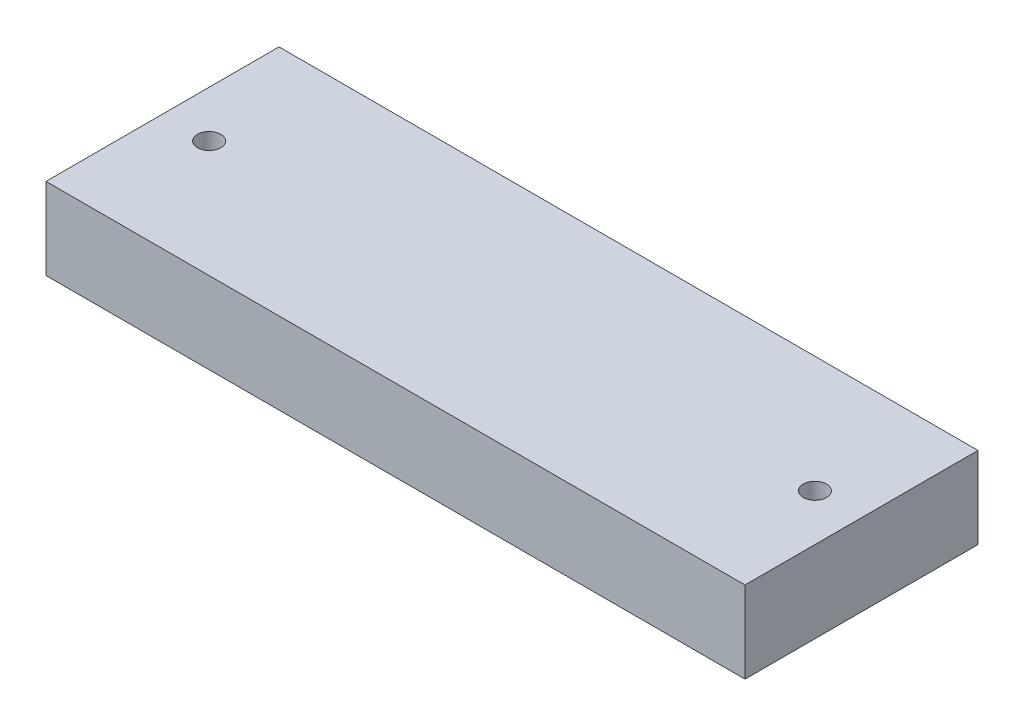
ISO-10303-21;
HEADER;
FILE_DESCRIPTION(('STEP AP214'),'2;1');
FILE_NAME('part.step','',(''),(''),'','','');
FILE_SCHEMA(('AUTOMOTIVE_DESIGN { 1 0 10303 214 1 1 1 1 }'));
ENDSEC;
DATA;
#1=APPLICATION_CONTEXT('core data for automotive mechanical design processes');
#2=APPLICATION_PROTOCOL_DEFINITION('international standard','automotive_design',2000,#1);
#3=PRODUCT_CONTEXT('',#1,'mechanical');
#4=PRODUCT('Part','Part','',(#3));
#5=PRODUCT_RELATED_PRODUCT_CATEGORY('part','',(#4));
#6=PRODUCT_DEFINITION_FORMATION('','',#4);
#7=PRODUCT_DEFINITION_CONTEXT('part definition',#1,'design');
#8=PRODUCT_DEFINITION('design','',#6,#7);
#9=PRODUCT_DEFINITION_SHAPE('','',#8);
#10=(LENGTH_UNIT() NAMED_UNIT(*) SI_UNIT(.MILLI.,.METRE.));
#11=(NAMED_UNIT(*) PLANE_ANGLE_UNIT() SI_UNIT($,.RADIAN.));
#12=(NAMED_UNIT(*) SI_UNIT($,.STERADIAN.) SOLID_ANGLE_UNIT());
#13=UNCERTAINTY_MEASURE_WITH_UNIT(LENGTH_MEASURE(1.E-05),#10,'distance_accuracy_value','');
#14=(GEOMETRIC_REPRESENTATION_CONTEXT(3) GLOBAL_UNCERTAINTY_ASSIGNED_CONTEXT((#13)) GLOBAL_UNIT_ASSIGNED_CONTEXT((#10,
#11,#12)) REPRESENTATION_CONTEXT('',''));
#15=CARTESIAN_POINT('',(0.,0.,0.));
#16=DIRECTION('',(0.,0.,1.));
#17=DIRECTION('',(1.,0.,0.));
#18=AXIS2_PLACEMENT_3D('',#15,#16,#17);
#19=CARTESIAN_POINT('',(150.,35.,-50.));
#20=DIRECTION('',(-1.,0.,0.));
#21=DIRECTION('',(0.,0.,1.));
#22=AXIS2_PLACEMENT_3D('',#19,#20,#21);
#23=PLANE('',#22);
#24=DIRECTION('',(0.,0.,-1.));
#25=VECTOR('',#24,1.);
#26=CARTESIAN_POINT('',(150.,0.,-50.));
#27=LINE('',#26,#25);
#28=CARTESIAN_POINT('',(150.,0.,50.));
#29=VERTEX_POINT('',#28);
#30=CARTESIAN_POINT('',(150.,0.,-50.));
#31=VERTEX_POINT('',#30);
#32=EDGE_CURVE('E107',#29,#31,#27,.T.);
#33=ORIENTED_EDGE('',*,*,#32,.T.);
#34=DIRECTION('',(0.,-1.,0.));
#35=VECTOR('',#34,1.);
#36=CARTESIAN_POINT('',(150.,35.,-50.));
#37=LINE('',#36,#35);
#38=CARTESIAN_POINT('',(150.,35.,-50.));
#39=VERTEX_POINT('',#38);
#40=EDGE_CURVE('E11',#39,#31,#37,.T.);
#41=ORIENTED_EDGE('',*,*,#40,.F.);
#42=DIRECTION('',(0.,0.,-1.));
#43=VECTOR('',#42,1.);
#44=CARTESIAN_POINT('',(150.,35.,-50.));
#45=LINE('',#44,#43);
#46=CARTESIAN_POINT('',(150.,35.,50.));
#47=VERTEX_POINT('',#46);
#48=EDGE_CURVE('E91',#47,#39,#45,.T.);
#49=ORIENTED_EDGE('',*,*,#48,.F.);
#50=DIRECTION('',(0.,-1.,0.));
#51=VECTOR('',#50,1.);
#52=CARTESIAN_POINT('',(150.,35.,50.));
#53=LINE('',#52,#51);
#54=EDGE_CURVE('E103',#47,#29,#53,.T.);
#55=ORIENTED_EDGE('',*,*,#54,.T.);
#56=EDGE_LOOP('',(#33,#41,#49,#55));
#57=FACE_BOUND('',#56,.T.);
#58=ADVANCED_FACE('F39',(#57),#23,.F.);
#59=CARTESIAN_POINT('',(-150.,35.,-50.));
#60=DIRECTION('',(0.,0.,1.));
#61=DIRECTION('',(1.,0.,0.));
#62=AXIS2_PLACEMENT_3D('',#59,#60,#61);
#63=PLANE('',#62);
#64=DIRECTION('',(-1.,0.,0.));
#65=VECTOR('',#64,1.);
#66=CARTESIAN_POINT('',(-150.,0.,-50.));
#67=LINE('',#66,#65);
#68=CARTESIAN_POINT('',(-150.,0.,-50.));
#69=VERTEX_POINT('',#68);
#70=EDGE_CURVE('E96',#31,#69,#67,.T.);
#71=ORIENTED_EDGE('',*,*,#70,.T.);
#72=DIRECTION('',(0.,-1.,0.));
#73=VECTOR('',#72,1.);
#74=CARTESIAN_POINT('',(-150.,35.,-50.));
#75=LINE('',#74,#73);
#76=CARTESIAN_POINT('',(-150.,35.,-50.));
#77=VERTEX_POINT('',#76);
#78=EDGE_CURVE('E48',#77,#69,#75,.T.);
#79=ORIENTED_EDGE('',*,*,#78,.F.);
#80=DIRECTION('',(-1.,0.,0.));
#81=VECTOR('',#80,1.);
#82=CARTESIAN_POINT('',(-150.,35.,-50.));
#83=LINE('',#82,#81);
#84=EDGE_CURVE('E86',#39,#77,#83,.T.);
#85=ORIENTED_EDGE('',*,*,#84,.F.);
#86=ORIENTED_EDGE('',*,*,#40,.T.);
#87=EDGE_LOOP('',(#71,#79,#85,#86));
#88=FACE_BOUND('',#87,.T.);
#89=ADVANCED_FACE('F95',(#88),#63,.F.);
#90=CARTESIAN_POINT('',(-150.,35.,-50.));
#91=DIRECTION('',(1.,0.,0.));
#92=DIRECTION('',(0.,0.,-1.));
#93=AXIS2_PLACEMENT_3D('',#90,#91,#92);
#94=PLANE('',#93);
#95=DIRECTION('',(0.,0.,1.));
#96=VECTOR('',#95,1.);
#97=CARTESIAN_POINT('',(-150.,0.,-50.));
#98=LINE('',#97,#96);
#99=CARTESIAN_POINT('',(-150.,0.,50.));
#100=VERTEX_POINT('',#99);
#101=EDGE_CURVE('E73',#69,#100,#98,.T.);
#102=ORIENTED_EDGE('',*,*,#101,.T.);
#103=DIRECTION('',(0.,-1.,0.));
#104=VECTOR('',#103,1.);
#105=CARTESIAN_POINT('',(-150.,35.,50.));
#106=LINE('',#105,#104);
#107=CARTESIAN_POINT('',(-150.,35.,50.));
#108=VERTEX_POINT('',#107);
#109=EDGE_CURVE('E98',#108,#100,#106,.T.);
#110=ORIENTED_EDGE('',*,*,#109,.F.);
#111=DIRECTION('',(0.,0.,1.));
#112=VECTOR('',#111,1.);
#113=CARTESIAN_POINT('',(-150.,35.,-50.));
#114=LINE('',#113,#112);
#115=EDGE_CURVE('E89',#77,#108,#114,.T.);
#116=ORIENTED_EDGE('',*,*,#115,.F.);
#117=ORIENTED_EDGE('',*,*,#78,.T.);
#118=EDGE_LOOP('',(#102,#110,#116,#117));
#119=FACE_BOUND('',#118,.T.);
#120=ADVANCED_FACE('F99',(#119),#94,.F.);
#121=CARTESIAN_POINT('',(-150.,35.,50.));
#122=DIRECTION('',(0.,0.,-1.));
#123=DIRECTION('',(-1.,0.,0.));
#124=AXIS2_PLACEMENT_3D('',#121,#122,#123);
#125=PLANE('',#124);
#126=DIRECTION('',(1.,0.,0.));
#127=VECTOR('',#126,1.);
#128=CARTESIAN_POINT('',(-150.,0.,50.));
#129=LINE('',#128,#127);
#130=EDGE_CURVE('E79',#100,#29,#129,.T.);
#131=ORIENTED_EDGE('',*,*,#130,.T.);
#132=ORIENTED_EDGE('',*,*,#54,.F.);
#133=DIRECTION('',(1.,0.,0.));
#134=VECTOR('',#133,1.);
#135=CARTESIAN_POINT('',(-150.,35.,50.));
#136=LINE('',#135,#134);
#137=EDGE_CURVE('E56',#108,#47,#136,.T.);
#138=ORIENTED_EDGE('',*,*,#137,.F.);
#139=ORIENTED_EDGE('',*,*,#109,.T.);
#140=EDGE_LOOP('',(#131,#132,#138,#139));
#141=FACE_BOUND('',#140,.T.);
#142=ADVANCED_FACE('F121',(#141),#125,.F.);
#143=CARTESIAN_POINT('',(0.,35.,0.));
#144=DIRECTION('',(0.,1.,0.));
#145=DIRECTION('',(0.,0.,1.));
#146=AXIS2_PLACEMENT_3D('',#143,#144,#145);
#147=PLANE('',#146);
#148=CARTESIAN_POINT('',(-130.,35.,0.));
#149=DIRECTION('',(0.,1.,0.));
#150=DIRECTION('',(0.,0.,1.));
#151=AXIS2_PLACEMENT_3D('',#148,#149,#150);
#152=CIRCLE('',#151,5.00000000000002);
#153=CARTESIAN_POINT('',(-130.,35.,5.00000000000002));
#154=VERTEX_POINT('',#153);
#155=EDGE_CURVE('E136',#154,#154,#152,.T.);
#156=ORIENTED_EDGE('',*,*,#155,.F.);
#157=EDGE_LOOP('',(#156));
#158=FACE_BOUND('',#157,.T.);
#159=CARTESIAN_POINT('',(130.,35.,-1.66533453693773E-13));
#160=DIRECTION('',(0.,1.,0.));
#161=DIRECTION('',(0.,0.,-1.));
#162=AXIS2_PLACEMENT_3D('',#159,#160,#161);
#163=CIRCLE('',#162,5.00000000000002);
#164=CARTESIAN_POINT('',(130.,35.,-5.00000000000018));
#165=VERTEX_POINT('',#164);
#166=EDGE_CURVE('E128',#165,#165,#163,.T.);
#167=ORIENTED_EDGE('',*,*,#166,.F.);
#168=EDGE_LOOP('',(#167));
#169=FACE_BOUND('',#168,.T.);
#170=ORIENTED_EDGE('',*,*,#48,.T.);
#171=ORIENTED_EDGE('',*,*,#84,.T.);
#172=ORIENTED_EDGE('',*,*,#115,.T.);
#173=ORIENTED_EDGE('',*,*,#137,.T.);
#174=EDGE_LOOP('',(#170,#171,#172,#173));
#175=FACE_BOUND('',#174,.T.);
#176=ADVANCED_FACE('F87',(#158,#169,#175),#147,.T.);
#177=CARTESIAN_POINT('',(0.,0.,0.));
#178=DIRECTION('',(0.,1.,0.));
#179=DIRECTION('',(0.,0.,1.));
#180=AXIS2_PLACEMENT_3D('',#177,#178,#179);
#181=PLANE('',#180);
#182=CARTESIAN_POINT('',(-130.,0.,0.));
#183=DIRECTION('',(0.,1.,0.));
#184=DIRECTION('',(0.,0.,1.));
#185=AXIS2_PLACEMENT_3D('',#182,#183,#184);
#186=CIRCLE('',#185,5.00000000000002);
#187=CARTESIAN_POINT('',(-130.,0.,5.00000000000002));
#188=VERTEX_POINT('',#187);
#189=EDGE_CURVE('E111',#188,#188,#186,.T.);
#190=ORIENTED_EDGE('',*,*,#189,.T.);
#191=EDGE_LOOP('',(#190));
#192=FACE_BOUND('',#191,.T.);
#193=CARTESIAN_POINT('',(130.,0.,-1.66533453693773E-13));
#194=DIRECTION('',(0.,1.,0.));
#195=DIRECTION('',(0.,0.,-1.));
#196=AXIS2_PLACEMENT_3D('',#193,#194,#195);
#197=CIRCLE('',#196,5.00000000000002);
#198=CARTESIAN_POINT('',(130.,0.,-5.00000000000018));
#199=VERTEX_POINT('',#198);
#200=EDGE_CURVE('E132',#199,#199,#197,.T.);
#201=ORIENTED_EDGE('',*,*,#200,.T.);
#202=EDGE_LOOP('',(#201));
#203=FACE_BOUND('',#202,.T.);
#204=ORIENTED_EDGE('',*,*,#32,.F.);
#205=ORIENTED_EDGE('',*,*,#130,.F.);
#206=ORIENTED_EDGE('',*,*,#101,.F.);
#207=ORIENTED_EDGE('',*,*,#70,.F.);
#208=EDGE_LOOP('',(#204,#205,#206,#207));
#209=FACE_BOUND('',#208,.T.);
#210=ADVANCED_FACE('F124',(#192,#203,#209),#181,.F.);
#211=CARTESIAN_POINT('',(130.,0.,-1.66533453693773E-13));
#212=DIRECTION('',(0.,1.,0.));
#213=DIRECTION('',(0.,0.,1.));
#214=AXIS2_PLACEMENT_3D('',#211,#212,#213);
#215=CYLINDRICAL_SURFACE('',#214,5.00000000000002);
#216=ORIENTED_EDGE('',*,*,#200,.F.);
#217=EDGE_LOOP('',(#216));
#218=FACE_BOUND('',#217,.T.);
#219=ORIENTED_EDGE('',*,*,#166,.T.);
#220=EDGE_LOOP('',(#219));
#221=FACE_BOUND('',#220,.T.);
#222=ADVANCED_FACE('F149',(#218,#221),#215,.F.);
#223=CARTESIAN_POINT('',(-130.,0.,0.));
#224=DIRECTION('',(0.,1.,0.));
#225=DIRECTION('',(0.,0.,1.));
#226=AXIS2_PLACEMENT_3D('',#223,#224,#225);
#227=CYLINDRICAL_SURFACE('',#226,5.00000000000002);
#228=ORIENTED_EDGE('',*,*,#189,.F.);
#229=EDGE_LOOP('',(#228));
#230=FACE_BOUND('',#229,.T.);
#231=ORIENTED_EDGE('',*,*,#155,.T.);
#232=EDGE_LOOP('',(#231));
#233=FACE_BOUND('',#232,.T.);
#234=ADVANCED_FACE('F146',(#230,#233),#227,.F.);
#235=CLOSED_SHELL('',(#58,#89,#120,#142,#176,#210,#222,#234));
#236=MANIFOLD_SOLID_BREP('B2',#235);
#237=ADVANCED_BREP_SHAPE_REPRESENTATION('',(#18,#236),#14);
#238=SHAPE_DEFINITION_REPRESENTATION(#9,#237);
ENDSEC;
END-ISO-10303-21;
